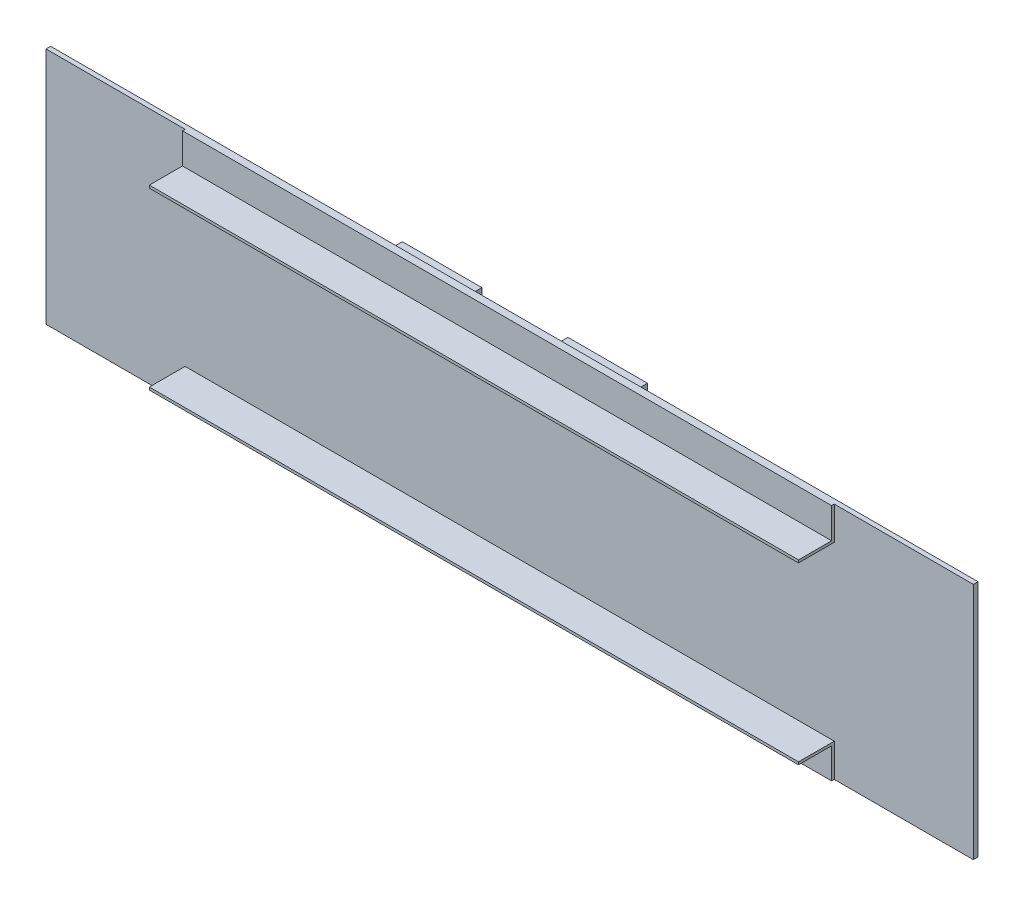
ISO-10303-21;
HEADER;
FILE_DESCRIPTION(('STEP AP214'),'2;1');
FILE_NAME('part.step','',(''),(''),'','','');
FILE_SCHEMA(('AUTOMOTIVE_DESIGN { 1 0 10303 214 1 1 1 1 }'));
ENDSEC;
DATA;
#1=APPLICATION_CONTEXT('core data for automotive mechanical design processes');
#2=APPLICATION_PROTOCOL_DEFINITION('international standard','automotive_design',2000,#1);
#3=PRODUCT_CONTEXT('',#1,'mechanical');
#4=PRODUCT('Part','Part','',(#3));
#5=PRODUCT_RELATED_PRODUCT_CATEGORY('part','',(#4));
#6=PRODUCT_DEFINITION_FORMATION('','',#4);
#7=PRODUCT_DEFINITION_CONTEXT('part definition',#1,'design');
#8=PRODUCT_DEFINITION('design','',#6,#7);
#9=PRODUCT_DEFINITION_SHAPE('','',#8);
#10=(LENGTH_UNIT() NAMED_UNIT(*) SI_UNIT(.MILLI.,.METRE.));
#11=(NAMED_UNIT(*) PLANE_ANGLE_UNIT() SI_UNIT($,.RADIAN.));
#12=(NAMED_UNIT(*) SI_UNIT($,.STERADIAN.) SOLID_ANGLE_UNIT());
#13=UNCERTAINTY_MEASURE_WITH_UNIT(LENGTH_MEASURE(1.E-05),#10,'distance_accuracy_value','');
#14=(GEOMETRIC_REPRESENTATION_CONTEXT(3) GLOBAL_UNCERTAINTY_ASSIGNED_CONTEXT((#13)) GLOBAL_UNIT_ASSIGNED_CONTEXT((#10,
#11,#12)) REPRESENTATION_CONTEXT('',''));
#15=CARTESIAN_POINT('',(0.,0.,0.));
#16=DIRECTION('',(0.,0.,1.));
#17=DIRECTION('',(1.,0.,0.));
#18=AXIS2_PLACEMENT_3D('',#15,#16,#17);
#19=CARTESIAN_POINT('',(1400.,-360.,0.));
#20=DIRECTION('',(0.,0.,1.));
#21=DIRECTION('',(1.,0.,0.));
#22=AXIS2_PLACEMENT_3D('',#19,#20,#21);
#23=PLANE('',#22);
#24=DIRECTION('',(0.,1.,0.));
#25=VECTOR('',#24,1.);
#26=CARTESIAN_POINT('',(-370.000000000001,-360.,0.));
#27=LINE('',#26,#25);
#28=CARTESIAN_POINT('',(-370.000000000001,-348.,0.));
#29=VERTEX_POINT('',#28);
#30=CARTESIAN_POINT('',(-370.000000000001,-268.,0.));
#31=VERTEX_POINT('',#30);
#32=EDGE_CURVE('E338',#29,#31,#27,.T.);
#33=ORIENTED_EDGE('',*,*,#32,.F.);
#34=DIRECTION('',(-1.,0.,0.));
#35=VECTOR('',#34,1.);
#36=CARTESIAN_POINT('',(1400.,-348.,0.));
#37=LINE('',#36,#35);
#38=CARTESIAN_POINT('',(-130.000000000001,-348.,0.));
#39=VERTEX_POINT('',#38);
#40=EDGE_CURVE('E42',#39,#29,#37,.T.);
#41=ORIENTED_EDGE('',*,*,#40,.F.);
#42=DIRECTION('',(0.,-1.,0.));
#43=VECTOR('',#42,1.);
#44=CARTESIAN_POINT('',(-130.000000000001,-360.,0.));
#45=LINE('',#44,#43);
#46=CARTESIAN_POINT('',(-130.000000000001,-268.,0.));
#47=VERTEX_POINT('',#46);
#48=EDGE_CURVE('E327',#47,#39,#45,.T.);
#49=ORIENTED_EDGE('',*,*,#48,.F.);
#50=DIRECTION('',(1.,0.,0.));
#51=VECTOR('',#50,1.);
#52=CARTESIAN_POINT('',(1400.,-268.,0.));
#53=LINE('',#52,#51);
#54=EDGE_CURVE('E11',#31,#47,#53,.T.);
#55=ORIENTED_EDGE('',*,*,#54,.F.);
#56=EDGE_LOOP('',(#33,#41,#49,#55));
#57=FACE_BOUND('',#56,.T.);
#58=DIRECTION('',(-1.,0.,0.));
#59=VECTOR('',#58,1.);
#60=CARTESIAN_POINT('',(1400.,348.,0.));
#61=LINE('',#60,#59);
#62=CARTESIAN_POINT('',(-130.000000000001,348.,0.));
#63=VERTEX_POINT('',#62);
#64=CARTESIAN_POINT('',(-370.000000000001,348.,0.));
#65=VERTEX_POINT('',#64);
#66=EDGE_CURVE('E373',#63,#65,#61,.T.);
#67=ORIENTED_EDGE('',*,*,#66,.T.);
#68=DIRECTION('',(0.,-1.,0.));
#69=VECTOR('',#68,1.);
#70=CARTESIAN_POINT('',(-370.000000000001,-360.,0.));
#71=LINE('',#70,#69);
#72=CARTESIAN_POINT('',(-370.000000000001,268.,0.));
#73=VERTEX_POINT('',#72);
#74=EDGE_CURVE('E367',#65,#73,#71,.T.);
#75=ORIENTED_EDGE('',*,*,#74,.T.);
#76=DIRECTION('',(1.,0.,0.));
#77=VECTOR('',#76,1.);
#78=CARTESIAN_POINT('',(1400.,268.,0.));
#79=LINE('',#78,#77);
#80=CARTESIAN_POINT('',(-130.000000000001,268.,0.));
#81=VERTEX_POINT('',#80);
#82=EDGE_CURVE('E370',#73,#81,#79,.T.);
#83=ORIENTED_EDGE('',*,*,#82,.T.);
#84=DIRECTION('',(0.,1.,0.));
#85=VECTOR('',#84,1.);
#86=CARTESIAN_POINT('',(-130.000000000001,-360.,0.));
#87=LINE('',#86,#85);
#88=EDGE_CURVE('E357',#81,#63,#87,.T.);
#89=ORIENTED_EDGE('',*,*,#88,.T.);
#90=EDGE_LOOP('',(#67,#75,#83,#89));
#91=FACE_BOUND('',#90,.T.);
#92=DIRECTION('',(0.,1.,0.));
#93=VECTOR('',#92,1.);
#94=CARTESIAN_POINT('',(1400.,360.,0.));
#95=LINE('',#94,#93);
#96=CARTESIAN_POINT('',(1400.,-360.,0.));
#97=VERTEX_POINT('',#96);
#98=CARTESIAN_POINT('',(1400.,360.,0.));
#99=VERTEX_POINT('',#98);
#100=EDGE_CURVE('E466',#97,#99,#95,.T.);
#101=ORIENTED_EDGE('',*,*,#100,.F.);
#102=DIRECTION('',(1.,0.,0.));
#103=VECTOR('',#102,1.);
#104=CARTESIAN_POINT('',(-1400.,-360.,0.));
#105=LINE('',#104,#103);
#106=CARTESIAN_POINT('',(-1400.,-360.,0.));
#107=VERTEX_POINT('',#106);
#108=EDGE_CURVE('E473',#107,#97,#105,.T.);
#109=ORIENTED_EDGE('',*,*,#108,.F.);
#110=DIRECTION('',(0.,-1.,0.));
#111=VECTOR('',#110,1.);
#112=CARTESIAN_POINT('',(-1400.,360.,0.));
#113=LINE('',#112,#111);
#114=CARTESIAN_POINT('',(-1400.,360.,0.));
#115=VERTEX_POINT('',#114);
#116=EDGE_CURVE('E471',#115,#107,#113,.T.);
#117=ORIENTED_EDGE('',*,*,#116,.F.);
#118=DIRECTION('',(-1.,0.,0.));
#119=VECTOR('',#118,1.);
#120=CARTESIAN_POINT('',(-1400.,360.,0.));
#121=LINE('',#120,#119);
#122=EDGE_CURVE('E468',#99,#115,#121,.T.);
#123=ORIENTED_EDGE('',*,*,#122,.F.);
#124=EDGE_LOOP('',(#101,#109,#117,#123));
#125=FACE_BOUND('',#124,.T.);
#126=DIRECTION('',(1.,0.,0.));
#127=VECTOR('',#126,1.);
#128=CARTESIAN_POINT('',(1400.,-348.,0.));
#129=LINE('',#128,#127);
#130=CARTESIAN_POINT('',(130.000000000001,-348.,0.));
#131=VERTEX_POINT('',#130);
#132=CARTESIAN_POINT('',(370.000000000001,-348.,0.));
#133=VERTEX_POINT('',#132);
#134=EDGE_CURVE('E311',#131,#133,#129,.T.);
#135=ORIENTED_EDGE('',*,*,#134,.T.);
#136=DIRECTION('',(0.,1.,0.));
#137=VECTOR('',#136,1.);
#138=CARTESIAN_POINT('',(370.000000000001,-360.,0.));
#139=LINE('',#138,#137);
#140=CARTESIAN_POINT('',(370.000000000001,-268.,0.));
#141=VERTEX_POINT('',#140);
#142=EDGE_CURVE('E305',#133,#141,#139,.T.);
#143=ORIENTED_EDGE('',*,*,#142,.T.);
#144=DIRECTION('',(-1.,0.,0.));
#145=VECTOR('',#144,1.);
#146=CARTESIAN_POINT('',(1400.,-268.,0.));
#147=LINE('',#146,#145);
#148=CARTESIAN_POINT('',(130.000000000001,-268.,0.));
#149=VERTEX_POINT('',#148);
#150=EDGE_CURVE('E308',#141,#149,#147,.T.);
#151=ORIENTED_EDGE('',*,*,#150,.T.);
#152=DIRECTION('',(0.,-1.,0.));
#153=VECTOR('',#152,1.);
#154=CARTESIAN_POINT('',(130.000000000001,-360.,0.));
#155=LINE('',#154,#153);
#156=EDGE_CURVE('E295',#149,#131,#155,.T.);
#157=ORIENTED_EDGE('',*,*,#156,.T.);
#158=EDGE_LOOP('',(#135,#143,#151,#157));
#159=FACE_BOUND('',#158,.T.);
#160=DIRECTION('',(0.,-1.,0.));
#161=VECTOR('',#160,1.);
#162=CARTESIAN_POINT('',(370.000000000001,-360.,0.));
#163=LINE('',#162,#161);
#164=CARTESIAN_POINT('',(370.000000000001,348.,0.));
#165=VERTEX_POINT('',#164);
#166=CARTESIAN_POINT('',(370.000000000001,268.,0.));
#167=VERTEX_POINT('',#166);
#168=EDGE_CURVE('E275',#165,#167,#163,.T.);
#169=ORIENTED_EDGE('',*,*,#168,.F.);
#170=DIRECTION('',(1.,0.,0.));
#171=VECTOR('',#170,1.);
#172=CARTESIAN_POINT('',(1400.,348.,0.));
#173=LINE('',#172,#171);
#174=CARTESIAN_POINT('',(130.000000000001,348.,0.));
#175=VERTEX_POINT('',#174);
#176=EDGE_CURVE('E257',#175,#165,#173,.T.);
#177=ORIENTED_EDGE('',*,*,#176,.F.);
#178=DIRECTION('',(0.,1.,0.));
#179=VECTOR('',#178,1.);
#180=CARTESIAN_POINT('',(130.000000000001,-360.,0.));
#181=LINE('',#180,#179);
#182=CARTESIAN_POINT('',(130.000000000001,268.,0.));
#183=VERTEX_POINT('',#182);
#184=EDGE_CURVE('E54',#183,#175,#181,.T.);
#185=ORIENTED_EDGE('',*,*,#184,.F.);
#186=DIRECTION('',(-1.,0.,0.));
#187=VECTOR('',#186,1.);
#188=CARTESIAN_POINT('',(1400.,268.,0.));
#189=LINE('',#188,#187);
#190=EDGE_CURVE('E49',#167,#183,#189,.T.);
#191=ORIENTED_EDGE('',*,*,#190,.F.);
#192=EDGE_LOOP('',(#169,#177,#185,#191));
#193=FACE_BOUND('',#192,.T.);
#194=ADVANCED_FACE('F34',(#57,#91,#125,#159,#193),#23,.F.);
#195=CARTESIAN_POINT('',(-980.000000000001,-260.,22.));
#196=DIRECTION('',(0.,0.,1.));
#197=DIRECTION('',(1.,0.,0.));
#198=AXIS2_PLACEMENT_3D('',#195,#196,#197);
#199=PLANE('',#198);
#200=DIRECTION('',(-1.,0.,0.));
#201=VECTOR('',#200,1.);
#202=CARTESIAN_POINT('',(-980.000000000001,-268.,22.));
#203=LINE('',#202,#201);
#204=CARTESIAN_POINT('',(980.000000000001,-268.,22.));
#205=VERTEX_POINT('',#204);
#206=CARTESIAN_POINT('',(-980.000000000001,-268.,22.));
#207=VERTEX_POINT('',#206);
#208=EDGE_CURVE('E410',#205,#207,#203,.T.);
#209=ORIENTED_EDGE('',*,*,#208,.T.);
#210=DIRECTION('',(0.,1.,0.));
#211=VECTOR('',#210,1.);
#212=CARTESIAN_POINT('',(-980.000000000001,-360.,22.));
#213=LINE('',#212,#211);
#214=CARTESIAN_POINT('',(-980.000000000001,-360.,22.));
#215=VERTEX_POINT('',#214);
#216=EDGE_CURVE('E427',#215,#207,#213,.T.);
#217=ORIENTED_EDGE('',*,*,#216,.F.);
#218=DIRECTION('',(-1.,0.,0.));
#219=VECTOR('',#218,1.);
#220=CARTESIAN_POINT('',(-980.000000000001,-360.,22.));
#221=LINE('',#220,#219);
#222=CARTESIAN_POINT('',(980.000000000001,-360.,22.));
#223=VERTEX_POINT('',#222);
#224=EDGE_CURVE('E510',#223,#215,#221,.T.);
#225=ORIENTED_EDGE('',*,*,#224,.F.);
#226=DIRECTION('',(0.,1.,0.));
#227=VECTOR('',#226,1.);
#228=CARTESIAN_POINT('',(980.000000000001,-360.,22.));
#229=LINE('',#228,#227);
#230=EDGE_CURVE('E400',#223,#205,#229,.T.);
#231=ORIENTED_EDGE('',*,*,#230,.T.);
#232=EDGE_LOOP('',(#209,#217,#225,#231));
#233=FACE_BOUND('',#232,.T.);
#234=ADVANCED_FACE('F508',(#233),#199,.T.);
#235=CARTESIAN_POINT('',(1400.,-360.,14.));
#236=DIRECTION('',(0.,0.,1.));
#237=DIRECTION('',(1.,0.,0.));
#238=AXIS2_PLACEMENT_3D('',#235,#236,#237);
#239=PLANE('',#238);
#240=DIRECTION('',(0.,-1.,0.));
#241=VECTOR('',#240,1.);
#242=CARTESIAN_POINT('',(980.000000000001,360.,14.));
#243=LINE('',#242,#241);
#244=CARTESIAN_POINT('',(980.000000000001,360.,14.));
#245=VERTEX_POINT('',#244);
#246=CARTESIAN_POINT('',(980.000000000001,260.,14.));
#247=VERTEX_POINT('',#246);
#248=EDGE_CURVE('E382',#245,#247,#243,.T.);
#249=ORIENTED_EDGE('',*,*,#248,.T.);
#250=DIRECTION('',(1.,0.,0.));
#251=VECTOR('',#250,1.);
#252=CARTESIAN_POINT('',(-980.000000000001,260.,14.));
#253=LINE('',#252,#251);
#254=CARTESIAN_POINT('',(-980.000000000001,260.,14.));
#255=VERTEX_POINT('',#254);
#256=EDGE_CURVE('E546',#255,#247,#253,.T.);
#257=ORIENTED_EDGE('',*,*,#256,.F.);
#258=DIRECTION('',(0.,-1.,0.));
#259=VECTOR('',#258,1.);
#260=CARTESIAN_POINT('',(-980.000000000001,360.,14.));
#261=LINE('',#260,#259);
#262=CARTESIAN_POINT('',(-980.000000000001,360.,14.));
#263=VERTEX_POINT('',#262);
#264=EDGE_CURVE('E539',#263,#255,#261,.T.);
#265=ORIENTED_EDGE('',*,*,#264,.F.);
#266=DIRECTION('',(-1.,0.,0.));
#267=VECTOR('',#266,1.);
#268=CARTESIAN_POINT('',(-1400.,360.,14.));
#269=LINE('',#268,#267);
#270=CARTESIAN_POINT('',(-1400.,360.,14.));
#271=VERTEX_POINT('',#270);
#272=EDGE_CURVE('E453',#263,#271,#269,.T.);
#273=ORIENTED_EDGE('',*,*,#272,.T.);
#274=DIRECTION('',(0.,-1.,0.));
#275=VECTOR('',#274,1.);
#276=CARTESIAN_POINT('',(-1400.,360.,14.));
#277=LINE('',#276,#275);
#278=CARTESIAN_POINT('',(-1400.,-360.,14.));
#279=VERTEX_POINT('',#278);
#280=EDGE_CURVE('E452',#271,#279,#277,.T.);
#281=ORIENTED_EDGE('',*,*,#280,.T.);
#282=DIRECTION('',(1.,0.,0.));
#283=VECTOR('',#282,1.);
#284=CARTESIAN_POINT('',(-1400.,-360.,14.));
#285=LINE('',#284,#283);
#286=CARTESIAN_POINT('',(-980.000000000001,-360.,14.));
#287=VERTEX_POINT('',#286);
#288=EDGE_CURVE('E463',#279,#287,#285,.T.);
#289=ORIENTED_EDGE('',*,*,#288,.T.);
#290=DIRECTION('',(0.,1.,0.));
#291=VECTOR('',#290,1.);
#292=CARTESIAN_POINT('',(-980.000000000001,-360.,14.));
#293=LINE('',#292,#291);
#294=CARTESIAN_POINT('',(-980.000000000001,-260.,14.));
#295=VERTEX_POINT('',#294);
#296=EDGE_CURVE('E431',#287,#295,#293,.T.);
#297=ORIENTED_EDGE('',*,*,#296,.T.);
#298=DIRECTION('',(1.,0.,0.));
#299=VECTOR('',#298,1.);
#300=CARTESIAN_POINT('',(-980.000000000001,-260.,14.));
#301=LINE('',#300,#299);
#302=CARTESIAN_POINT('',(980.000000000001,-260.,14.));
#303=VERTEX_POINT('',#302);
#304=EDGE_CURVE('E501',#295,#303,#301,.T.);
#305=ORIENTED_EDGE('',*,*,#304,.T.);
#306=DIRECTION('',(0.,1.,0.));
#307=VECTOR('',#306,1.);
#308=CARTESIAN_POINT('',(980.000000000001,-360.,14.));
#309=LINE('',#308,#307);
#310=CARTESIAN_POINT('',(980.000000000001,-360.,14.));
#311=VERTEX_POINT('',#310);
#312=EDGE_CURVE('E399',#311,#303,#309,.T.);
#313=ORIENTED_EDGE('',*,*,#312,.F.);
#314=CARTESIAN_POINT('',(1400.,-360.,14.));
#315=VERTEX_POINT('',#314);
#316=EDGE_CURVE('E462',#311,#315,#285,.T.);
#317=ORIENTED_EDGE('',*,*,#316,.T.);
#318=DIRECTION('',(0.,1.,0.));
#319=VECTOR('',#318,1.);
#320=CARTESIAN_POINT('',(1400.,360.,14.));
#321=LINE('',#320,#319);
#322=CARTESIAN_POINT('',(1400.,360.,14.));
#323=VERTEX_POINT('',#322);
#324=EDGE_CURVE('E458',#315,#323,#321,.T.);
#325=ORIENTED_EDGE('',*,*,#324,.T.);
#326=EDGE_CURVE('E448',#323,#245,#269,.T.);
#327=ORIENTED_EDGE('',*,*,#326,.T.);
#328=EDGE_LOOP('',(#249,#257,#265,#273,#281,#289,#297,#305,#313,#317,#325,#327));
#329=FACE_BOUND('',#328,.T.);
#330=ADVANCED_FACE('F499',(#329),#239,.T.);
#331=CARTESIAN_POINT('',(1400.,360.,14.));
#332=DIRECTION('',(-1.,0.,0.));
#333=DIRECTION('',(0.,0.,1.));
#334=AXIS2_PLACEMENT_3D('',#331,#332,#333);
#335=PLANE('',#334);
#336=ORIENTED_EDGE('',*,*,#100,.T.);
#337=DIRECTION('',(0.,0.,-1.));
#338=VECTOR('',#337,1.);
#339=CARTESIAN_POINT('',(1400.,360.,14.));
#340=LINE('',#339,#338);
#341=EDGE_CURVE('E434',#323,#99,#340,.T.);
#342=ORIENTED_EDGE('',*,*,#341,.F.);
#343=ORIENTED_EDGE('',*,*,#324,.F.);
#344=DIRECTION('',(0.,0.,-1.));
#345=VECTOR('',#344,1.);
#346=CARTESIAN_POINT('',(1400.,-360.,14.));
#347=LINE('',#346,#345);
#348=EDGE_CURVE('E465',#315,#97,#347,.T.);
#349=ORIENTED_EDGE('',*,*,#348,.T.);
#350=EDGE_LOOP('',(#336,#342,#343,#349));
#351=FACE_BOUND('',#350,.T.);
#352=ADVANCED_FACE('F36',(#351),#335,.F.);
#353=CARTESIAN_POINT('',(-1400.,360.,14.));
#354=DIRECTION('',(0.,-1.,0.));
#355=DIRECTION('',(0.,0.,-1.));
#356=AXIS2_PLACEMENT_3D('',#353,#354,#355);
#357=PLANE('',#356);
#358=DIRECTION('',(0.,0.,-1.));
#359=VECTOR('',#358,1.);
#360=CARTESIAN_POINT('',(980.000000000001,360.,22.));
#361=LINE('',#360,#359);
#362=CARTESIAN_POINT('',(980.000000000001,360.,22.));
#363=VERTEX_POINT('',#362);
#364=EDGE_CURVE('E391',#363,#245,#361,.T.);
#365=ORIENTED_EDGE('',*,*,#364,.T.);
#366=ORIENTED_EDGE('',*,*,#326,.F.);
#367=ORIENTED_EDGE('',*,*,#341,.T.);
#368=ORIENTED_EDGE('',*,*,#122,.T.);
#369=DIRECTION('',(0.,0.,-1.));
#370=VECTOR('',#369,1.);
#371=CARTESIAN_POINT('',(-1400.,360.,14.));
#372=LINE('',#371,#370);
#373=EDGE_CURVE('E438',#271,#115,#372,.T.);
#374=ORIENTED_EDGE('',*,*,#373,.F.);
#375=ORIENTED_EDGE('',*,*,#272,.F.);
#376=DIRECTION('',(0.,0.,-1.));
#377=VECTOR('',#376,1.);
#378=CARTESIAN_POINT('',(-980.000000000001,360.,22.));
#379=LINE('',#378,#377);
#380=CARTESIAN_POINT('',(-980.000000000001,360.,22.));
#381=VERTEX_POINT('',#380);
#382=EDGE_CURVE('E552',#381,#263,#379,.T.);
#383=ORIENTED_EDGE('',*,*,#382,.F.);
#384=DIRECTION('',(-1.,0.,0.));
#385=VECTOR('',#384,1.);
#386=CARTESIAN_POINT('',(-980.000000000001,360.,22.));
#387=LINE('',#386,#385);
#388=EDGE_CURVE('E553',#363,#381,#387,.T.);
#389=ORIENTED_EDGE('',*,*,#388,.F.);
#390=EDGE_LOOP('',(#365,#366,#367,#368,#374,#375,#383,#389));
#391=FACE_BOUND('',#390,.T.);
#392=ADVANCED_FACE('F584',(#391),#357,.F.);
#393=CARTESIAN_POINT('',(-1400.,360.,14.));
#394=DIRECTION('',(1.,0.,0.));
#395=DIRECTION('',(0.,0.,-1.));
#396=AXIS2_PLACEMENT_3D('',#393,#394,#395);
#397=PLANE('',#396);
#398=ORIENTED_EDGE('',*,*,#116,.T.);
#399=DIRECTION('',(0.,0.,-1.));
#400=VECTOR('',#399,1.);
#401=CARTESIAN_POINT('',(-1400.,-360.,14.));
#402=LINE('',#401,#400);
#403=EDGE_CURVE('E444',#279,#107,#402,.T.);
#404=ORIENTED_EDGE('',*,*,#403,.F.);
#405=ORIENTED_EDGE('',*,*,#280,.F.);
#406=ORIENTED_EDGE('',*,*,#373,.T.);
#407=EDGE_LOOP('',(#398,#404,#405,#406));
#408=FACE_BOUND('',#407,.T.);
#409=ADVANCED_FACE('F571',(#408),#397,.F.);
#410=CARTESIAN_POINT('',(-1400.,-360.,14.));
#411=DIRECTION('',(0.,1.,0.));
#412=DIRECTION('',(0.,0.,1.));
#413=AXIS2_PLACEMENT_3D('',#410,#411,#412);
#414=PLANE('',#413);
#415=ORIENTED_EDGE('',*,*,#316,.F.);
#416=DIRECTION('',(0.,0.,-1.));
#417=VECTOR('',#416,1.);
#418=CARTESIAN_POINT('',(980.000000000001,-360.,22.));
#419=LINE('',#418,#417);
#420=EDGE_CURVE('E403',#223,#311,#419,.T.);
#421=ORIENTED_EDGE('',*,*,#420,.F.);
#422=ORIENTED_EDGE('',*,*,#224,.T.);
#423=DIRECTION('',(0.,0.,-1.));
#424=VECTOR('',#423,1.);
#425=CARTESIAN_POINT('',(-980.000000000001,-360.,22.));
#426=LINE('',#425,#424);
#427=EDGE_CURVE('E514',#215,#287,#426,.T.);
#428=ORIENTED_EDGE('',*,*,#427,.T.);
#429=ORIENTED_EDGE('',*,*,#288,.F.);
#430=ORIENTED_EDGE('',*,*,#403,.T.);
#431=ORIENTED_EDGE('',*,*,#108,.T.);
#432=ORIENTED_EDGE('',*,*,#348,.F.);
#433=EDGE_LOOP('',(#415,#421,#422,#428,#429,#430,#431,#432));
#434=FACE_BOUND('',#433,.T.);
#435=ADVANCED_FACE('F482',(#434),#414,.F.);
#436=CARTESIAN_POINT('',(-980.000000000001,360.,22.));
#437=DIRECTION('',(1.,0.,0.));
#438=DIRECTION('',(0.,0.,-1.));
#439=AXIS2_PLACEMENT_3D('',#436,#437,#438);
#440=PLANE('',#439);
#441=ORIENTED_EDGE('',*,*,#264,.T.);
#442=DIRECTION('',(0.,0.,-1.));
#443=VECTOR('',#442,1.);
#444=CARTESIAN_POINT('',(-980.000000000001,260.,22.));
#445=LINE('',#444,#443);
#446=CARTESIAN_POINT('',(-980.000000000001,260.,122.));
#447=VERTEX_POINT('',#446);
#448=EDGE_CURVE('E469',#447,#255,#445,.T.);
#449=ORIENTED_EDGE('',*,*,#448,.F.);
#450=DIRECTION('',(0.,-1.,0.));
#451=VECTOR('',#450,1.);
#452=CARTESIAN_POINT('',(-980.000000000001,260.,122.));
#453=LINE('',#452,#451);
#454=CARTESIAN_POINT('',(-980.000000000001,268.,122.));
#455=VERTEX_POINT('',#454);
#456=EDGE_CURVE('E521',#455,#447,#453,.T.);
#457=ORIENTED_EDGE('',*,*,#456,.F.);
#458=DIRECTION('',(0.,0.,-1.));
#459=VECTOR('',#458,1.);
#460=CARTESIAN_POINT('',(-980.000000000001,268.,122.));
#461=LINE('',#460,#459);
#462=CARTESIAN_POINT('',(-980.000000000001,268.,22.));
#463=VERTEX_POINT('',#462);
#464=EDGE_CURVE('E528',#455,#463,#461,.T.);
#465=ORIENTED_EDGE('',*,*,#464,.T.);
#466=DIRECTION('',(0.,-1.,0.));
#467=VECTOR('',#466,1.);
#468=CARTESIAN_POINT('',(-980.000000000001,360.,22.));
#469=LINE('',#468,#467);
#470=EDGE_CURVE('E536',#381,#463,#469,.T.);
#471=ORIENTED_EDGE('',*,*,#470,.F.);
#472=ORIENTED_EDGE('',*,*,#382,.T.);
#473=EDGE_LOOP('',(#441,#449,#457,#465,#471,#472));
#474=FACE_BOUND('',#473,.T.);
#475=ADVANCED_FACE('F561',(#474),#440,.F.);
#476=CARTESIAN_POINT('',(-980.000000000001,260.,22.));
#477=DIRECTION('',(0.,1.,0.));
#478=DIRECTION('',(0.,0.,1.));
#479=AXIS2_PLACEMENT_3D('',#476,#477,#478);
#480=PLANE('',#479);
#481=ORIENTED_EDGE('',*,*,#256,.T.);
#482=DIRECTION('',(0.,0.,-1.));
#483=VECTOR('',#482,1.);
#484=CARTESIAN_POINT('',(980.000000000001,260.,22.));
#485=LINE('',#484,#483);
#486=CARTESIAN_POINT('',(980.000000000001,260.,122.));
#487=VERTEX_POINT('',#486);
#488=EDGE_CURVE('E386',#487,#247,#485,.T.);
#489=ORIENTED_EDGE('',*,*,#488,.F.);
#490=DIRECTION('',(1.,0.,0.));
#491=VECTOR('',#490,1.);
#492=CARTESIAN_POINT('',(-980.000000000001,260.,122.));
#493=LINE('',#492,#491);
#494=EDGE_CURVE('E524',#447,#487,#493,.T.);
#495=ORIENTED_EDGE('',*,*,#494,.F.);
#496=ORIENTED_EDGE('',*,*,#448,.T.);
#497=EDGE_LOOP('',(#481,#489,#495,#496));
#498=FACE_BOUND('',#497,.T.);
#499=ADVANCED_FACE('F563',(#498),#480,.F.);
#500=CARTESIAN_POINT('',(-980.000000000001,260.,22.));
#501=DIRECTION('',(0.,0.,1.));
#502=DIRECTION('',(1.,0.,0.));
#503=AXIS2_PLACEMENT_3D('',#500,#501,#502);
#504=PLANE('',#503);
#505=ORIENTED_EDGE('',*,*,#470,.T.);
#506=DIRECTION('',(-1.,0.,0.));
#507=VECTOR('',#506,1.);
#508=CARTESIAN_POINT('',(-980.000000000001,268.,22.));
#509=LINE('',#508,#507);
#510=CARTESIAN_POINT('',(980.000000000001,268.,22.));
#511=VERTEX_POINT('',#510);
#512=EDGE_CURVE('E520',#511,#463,#509,.T.);
#513=ORIENTED_EDGE('',*,*,#512,.F.);
#514=DIRECTION('',(0.,-1.,0.));
#515=VECTOR('',#514,1.);
#516=CARTESIAN_POINT('',(980.000000000001,360.,22.));
#517=LINE('',#516,#515);
#518=EDGE_CURVE('E383',#363,#511,#517,.T.);
#519=ORIENTED_EDGE('',*,*,#518,.F.);
#520=ORIENTED_EDGE('',*,*,#388,.T.);
#521=EDGE_LOOP('',(#505,#513,#519,#520));
#522=FACE_BOUND('',#521,.T.);
#523=ADVANCED_FACE('F560',(#522),#504,.T.);
#524=CARTESIAN_POINT('',(-980.000000000001,268.,122.));
#525=DIRECTION('',(0.,-1.,0.));
#526=DIRECTION('',(0.,0.,-1.));
#527=AXIS2_PLACEMENT_3D('',#524,#525,#526);
#528=PLANE('',#527);
#529=ORIENTED_EDGE('',*,*,#512,.T.);
#530=ORIENTED_EDGE('',*,*,#464,.F.);
#531=DIRECTION('',(-1.,0.,0.));
#532=VECTOR('',#531,1.);
#533=CARTESIAN_POINT('',(-980.000000000001,268.,122.));
#534=LINE('',#533,#532);
#535=CARTESIAN_POINT('',(980.000000000001,268.,122.));
#536=VERTEX_POINT('',#535);
#537=EDGE_CURVE('E526',#536,#455,#534,.T.);
#538=ORIENTED_EDGE('',*,*,#537,.F.);
#539=DIRECTION('',(0.,0.,-1.));
#540=VECTOR('',#539,1.);
#541=CARTESIAN_POINT('',(980.000000000001,268.,122.));
#542=LINE('',#541,#540);
#543=EDGE_CURVE('E379',#536,#511,#542,.T.);
#544=ORIENTED_EDGE('',*,*,#543,.T.);
#545=EDGE_LOOP('',(#529,#530,#538,#544));
#546=FACE_BOUND('',#545,.T.);
#547=ADVANCED_FACE('F601',(#546),#528,.F.);
#548=CARTESIAN_POINT('',(-980.000000000001,268.,122.));
#549=DIRECTION('',(0.,0.,-1.));
#550=DIRECTION('',(-1.,0.,0.));
#551=AXIS2_PLACEMENT_3D('',#548,#549,#550);
#552=PLANE('',#551);
#553=ORIENTED_EDGE('',*,*,#456,.T.);
#554=ORIENTED_EDGE('',*,*,#494,.T.);
#555=DIRECTION('',(0.,-1.,0.));
#556=VECTOR('',#555,1.);
#557=CARTESIAN_POINT('',(980.000000000001,260.,122.));
#558=LINE('',#557,#556);
#559=EDGE_CURVE('E376',#536,#487,#558,.T.);
#560=ORIENTED_EDGE('',*,*,#559,.F.);
#561=ORIENTED_EDGE('',*,*,#537,.T.);
#562=EDGE_LOOP('',(#553,#554,#560,#561));
#563=FACE_BOUND('',#562,.T.);
#564=ADVANCED_FACE('F597',(#563),#552,.F.);
#565=CARTESIAN_POINT('',(-980.000000000001,-360.,22.));
#566=DIRECTION('',(-1.,0.,0.));
#567=DIRECTION('',(0.,0.,1.));
#568=AXIS2_PLACEMENT_3D('',#565,#566,#567);
#569=PLANE('',#568);
#570=ORIENTED_EDGE('',*,*,#296,.F.);
#571=ORIENTED_EDGE('',*,*,#427,.F.);
#572=ORIENTED_EDGE('',*,*,#216,.T.);
#573=DIRECTION('',(0.,0.,-1.));
#574=VECTOR('',#573,1.);
#575=CARTESIAN_POINT('',(-980.000000000001,-268.,122.));
#576=LINE('',#575,#574);
#577=CARTESIAN_POINT('',(-980.000000000001,-268.,122.));
#578=VERTEX_POINT('',#577);
#579=EDGE_CURVE('E419',#578,#207,#576,.T.);
#580=ORIENTED_EDGE('',*,*,#579,.F.);
#581=DIRECTION('',(0.,1.,0.));
#582=VECTOR('',#581,1.);
#583=CARTESIAN_POINT('',(-980.000000000001,-260.,122.));
#584=LINE('',#583,#582);
#585=CARTESIAN_POINT('',(-980.000000000001,-260.,122.));
#586=VERTEX_POINT('',#585);
#587=EDGE_CURVE('E411',#578,#586,#584,.T.);
#588=ORIENTED_EDGE('',*,*,#587,.T.);
#589=DIRECTION('',(0.,0.,-1.));
#590=VECTOR('',#589,1.);
#591=CARTESIAN_POINT('',(-980.000000000001,-260.,22.));
#592=LINE('',#591,#590);
#593=EDGE_CURVE('E512',#586,#295,#592,.T.);
#594=ORIENTED_EDGE('',*,*,#593,.T.);
#595=EDGE_LOOP('',(#570,#571,#572,#580,#588,#594));
#596=FACE_BOUND('',#595,.T.);
#597=ADVANCED_FACE('F608',(#596),#569,.T.);
#598=CARTESIAN_POINT('',(-980.000000000001,-260.,22.));
#599=DIRECTION('',(0.,1.,0.));
#600=DIRECTION('',(0.,0.,1.));
#601=AXIS2_PLACEMENT_3D('',#598,#599,#600);
#602=PLANE('',#601);
#603=ORIENTED_EDGE('',*,*,#304,.F.);
#604=ORIENTED_EDGE('',*,*,#593,.F.);
#605=DIRECTION('',(1.,0.,0.));
#606=VECTOR('',#605,1.);
#607=CARTESIAN_POINT('',(-980.000000000001,-260.,122.));
#608=LINE('',#607,#606);
#609=CARTESIAN_POINT('',(980.000000000001,-260.,122.));
#610=VERTEX_POINT('',#609);
#611=EDGE_CURVE('E417',#586,#610,#608,.T.);
#612=ORIENTED_EDGE('',*,*,#611,.T.);
#613=DIRECTION('',(0.,0.,-1.));
#614=VECTOR('',#613,1.);
#615=CARTESIAN_POINT('',(980.000000000001,-260.,22.));
#616=LINE('',#615,#614);
#617=EDGE_CURVE('E407',#610,#303,#616,.T.);
#618=ORIENTED_EDGE('',*,*,#617,.T.);
#619=EDGE_LOOP('',(#603,#604,#612,#618));
#620=FACE_BOUND('',#619,.T.);
#621=ADVANCED_FACE('F614',(#620),#602,.T.);
#622=CARTESIAN_POINT('',(-980.000000000001,-268.,122.));
#623=DIRECTION('',(0.,-1.,0.));
#624=DIRECTION('',(0.,0.,-1.));
#625=AXIS2_PLACEMENT_3D('',#622,#623,#624);
#626=PLANE('',#625);
#627=ORIENTED_EDGE('',*,*,#208,.F.);
#628=DIRECTION('',(0.,0.,-1.));
#629=VECTOR('',#628,1.);
#630=CARTESIAN_POINT('',(980.000000000001,-268.,122.));
#631=LINE('',#630,#629);
#632=CARTESIAN_POINT('',(980.000000000001,-268.,122.));
#633=VERTEX_POINT('',#632);
#634=EDGE_CURVE('E396',#633,#205,#631,.T.);
#635=ORIENTED_EDGE('',*,*,#634,.F.);
#636=DIRECTION('',(-1.,0.,0.));
#637=VECTOR('',#636,1.);
#638=CARTESIAN_POINT('',(-980.000000000001,-268.,122.));
#639=LINE('',#638,#637);
#640=EDGE_CURVE('E414',#633,#578,#639,.T.);
#641=ORIENTED_EDGE('',*,*,#640,.T.);
#642=ORIENTED_EDGE('',*,*,#579,.T.);
#643=EDGE_LOOP('',(#627,#635,#641,#642));
#644=FACE_BOUND('',#643,.T.);
#645=ADVANCED_FACE('F617',(#644),#626,.T.);
#646=CARTESIAN_POINT('',(-980.000000000001,-268.,122.));
#647=DIRECTION('',(0.,0.,-1.));
#648=DIRECTION('',(-1.,0.,0.));
#649=AXIS2_PLACEMENT_3D('',#646,#647,#648);
#650=PLANE('',#649);
#651=ORIENTED_EDGE('',*,*,#587,.F.);
#652=ORIENTED_EDGE('',*,*,#640,.F.);
#653=DIRECTION('',(0.,1.,0.));
#654=VECTOR('',#653,1.);
#655=CARTESIAN_POINT('',(980.000000000001,-260.,122.));
#656=LINE('',#655,#654);
#657=EDGE_CURVE('E393',#633,#610,#656,.T.);
#658=ORIENTED_EDGE('',*,*,#657,.T.);
#659=ORIENTED_EDGE('',*,*,#611,.F.);
#660=EDGE_LOOP('',(#651,#652,#658,#659));
#661=FACE_BOUND('',#660,.T.);
#662=ADVANCED_FACE('F622',(#661),#650,.F.);
#663=CARTESIAN_POINT('',(980.000000000001,-360.,22.));
#664=DIRECTION('',(-1.,0.,0.));
#665=DIRECTION('',(0.,0.,1.));
#666=AXIS2_PLACEMENT_3D('',#663,#664,#665);
#667=PLANE('',#666);
#668=ORIENTED_EDGE('',*,*,#312,.T.);
#669=ORIENTED_EDGE('',*,*,#617,.F.);
#670=ORIENTED_EDGE('',*,*,#657,.F.);
#671=ORIENTED_EDGE('',*,*,#634,.T.);
#672=ORIENTED_EDGE('',*,*,#230,.F.);
#673=ORIENTED_EDGE('',*,*,#420,.T.);
#674=EDGE_LOOP('',(#668,#669,#670,#671,#672,#673));
#675=FACE_BOUND('',#674,.T.);
#676=ADVANCED_FACE('F504',(#675),#667,.F.);
#677=CARTESIAN_POINT('',(980.000000000001,360.,22.));
#678=DIRECTION('',(1.,0.,0.));
#679=DIRECTION('',(0.,0.,-1.));
#680=AXIS2_PLACEMENT_3D('',#677,#678,#679);
#681=PLANE('',#680);
#682=ORIENTED_EDGE('',*,*,#248,.F.);
#683=ORIENTED_EDGE('',*,*,#364,.F.);
#684=ORIENTED_EDGE('',*,*,#518,.T.);
#685=ORIENTED_EDGE('',*,*,#543,.F.);
#686=ORIENTED_EDGE('',*,*,#559,.T.);
#687=ORIENTED_EDGE('',*,*,#488,.T.);
#688=EDGE_LOOP('',(#682,#683,#684,#685,#686,#687));
#689=FACE_BOUND('',#688,.T.);
#690=ADVANCED_FACE('F592',(#689),#681,.T.);
#691=CARTESIAN_POINT('',(-370.000000000001,348.,-10.));
#692=DIRECTION('',(0.,1.,0.));
#693=DIRECTION('',(0.,0.,1.));
#694=AXIS2_PLACEMENT_3D('',#691,#692,#693);
#695=PLANE('',#694);
#696=ORIENTED_EDGE('',*,*,#66,.F.);
#697=DIRECTION('',(0.,0.,1.));
#698=VECTOR('',#697,1.);
#699=CARTESIAN_POINT('',(-130.000000000001,348.,-10.));
#700=LINE('',#699,#698);
#701=CARTESIAN_POINT('',(-130.000000000001,348.,-32.));
#702=VERTEX_POINT('',#701);
#703=EDGE_CURVE('E358',#702,#63,#700,.T.);
#704=ORIENTED_EDGE('',*,*,#703,.F.);
#705=DIRECTION('',(-1.,0.,0.));
#706=VECTOR('',#705,1.);
#707=CARTESIAN_POINT('',(-370.000000000001,348.,-32.));
#708=LINE('',#707,#706);
#709=CARTESIAN_POINT('',(-370.000000000001,348.,-32.));
#710=VERTEX_POINT('',#709);
#711=EDGE_CURVE('E350',#702,#710,#708,.T.);
#712=ORIENTED_EDGE('',*,*,#711,.T.);
#713=DIRECTION('',(0.,0.,1.));
#714=VECTOR('',#713,1.);
#715=CARTESIAN_POINT('',(-370.000000000001,348.,-10.));
#716=LINE('',#715,#714);
#717=EDGE_CURVE('E354',#710,#65,#716,.T.);
#718=ORIENTED_EDGE('',*,*,#717,.T.);
#719=EDGE_LOOP('',(#696,#704,#712,#718));
#720=FACE_BOUND('',#719,.T.);
#721=ADVANCED_FACE('F631',(#720),#695,.T.);
#722=CARTESIAN_POINT('',(-370.000000000001,268.,-10.));
#723=DIRECTION('',(0.,-1.,0.));
#724=DIRECTION('',(1.,0.,0.));
#725=AXIS2_PLACEMENT_3D('',#722,#723,#724);
#726=PLANE('',#725);
#727=ORIENTED_EDGE('',*,*,#82,.F.);
#728=DIRECTION('',(0.,0.,1.));
#729=VECTOR('',#728,1.);
#730=CARTESIAN_POINT('',(-370.000000000001,268.,-10.));
#731=LINE('',#730,#729);
#732=CARTESIAN_POINT('',(-370.000000000001,268.,-32.));
#733=VERTEX_POINT('',#732);
#734=EDGE_CURVE('E353',#733,#73,#731,.T.);
#735=ORIENTED_EDGE('',*,*,#734,.F.);
#736=DIRECTION('',(1.,0.,0.));
#737=VECTOR('',#736,1.);
#738=CARTESIAN_POINT('',(-370.000000000001,268.,-32.));
#739=LINE('',#738,#737);
#740=CARTESIAN_POINT('',(-130.000000000001,268.,-32.));
#741=VERTEX_POINT('',#740);
#742=EDGE_CURVE('E344',#733,#741,#739,.T.);
#743=ORIENTED_EDGE('',*,*,#742,.T.);
#744=DIRECTION('',(0.,0.,1.));
#745=VECTOR('',#744,1.);
#746=CARTESIAN_POINT('',(-130.000000000001,268.,-10.));
#747=LINE('',#746,#745);
#748=EDGE_CURVE('E361',#741,#81,#747,.T.);
#749=ORIENTED_EDGE('',*,*,#748,.T.);
#750=EDGE_LOOP('',(#727,#735,#743,#749));
#751=FACE_BOUND('',#750,.T.);
#752=ADVANCED_FACE('F636',(#751),#726,.T.);
#753=CARTESIAN_POINT('',(-370.000000000001,268.,-10.));
#754=DIRECTION('',(-1.,0.,0.));
#755=DIRECTION('',(0.,0.,1.));
#756=AXIS2_PLACEMENT_3D('',#753,#754,#755);
#757=PLANE('',#756);
#758=ORIENTED_EDGE('',*,*,#74,.F.);
#759=ORIENTED_EDGE('',*,*,#717,.F.);
#760=DIRECTION('',(0.,-1.,0.));
#761=VECTOR('',#760,1.);
#762=CARTESIAN_POINT('',(-370.000000000001,268.,-32.));
#763=LINE('',#762,#761);
#764=EDGE_CURVE('E341',#710,#733,#763,.T.);
#765=ORIENTED_EDGE('',*,*,#764,.T.);
#766=ORIENTED_EDGE('',*,*,#734,.T.);
#767=EDGE_LOOP('',(#758,#759,#765,#766));
#768=FACE_BOUND('',#767,.T.);
#769=ADVANCED_FACE('F632',(#768),#757,.T.);
#770=CARTESIAN_POINT('',(-130.000000000001,268.,-10.));
#771=DIRECTION('',(1.,0.,0.));
#772=DIRECTION('',(0.,0.,-1.));
#773=AXIS2_PLACEMENT_3D('',#770,#771,#772);
#774=PLANE('',#773);
#775=ORIENTED_EDGE('',*,*,#88,.F.);
#776=ORIENTED_EDGE('',*,*,#748,.F.);
#777=DIRECTION('',(0.,1.,0.));
#778=VECTOR('',#777,1.);
#779=CARTESIAN_POINT('',(-130.000000000001,268.,-32.));
#780=LINE('',#779,#778);
#781=EDGE_CURVE('E347',#741,#702,#780,.T.);
#782=ORIENTED_EDGE('',*,*,#781,.T.);
#783=ORIENTED_EDGE('',*,*,#703,.T.);
#784=EDGE_LOOP('',(#775,#776,#782,#783));
#785=FACE_BOUND('',#784,.T.);
#786=ADVANCED_FACE('F635',(#785),#774,.T.);
#787=CARTESIAN_POINT('',(-370.000000000001,348.,-32.));
#788=DIRECTION('',(0.,0.,-1.));
#789=DIRECTION('',(-1.,0.,0.));
#790=AXIS2_PLACEMENT_3D('',#787,#788,#789);
#791=PLANE('',#790);
#792=ORIENTED_EDGE('',*,*,#764,.F.);
#793=ORIENTED_EDGE('',*,*,#711,.F.);
#794=ORIENTED_EDGE('',*,*,#781,.F.);
#795=ORIENTED_EDGE('',*,*,#742,.F.);
#796=EDGE_LOOP('',(#792,#793,#794,#795));
#797=FACE_BOUND('',#796,.T.);
#798=ADVANCED_FACE('F643',(#797),#791,.T.);
#799=CARTESIAN_POINT('',(-370.000000000001,-268.,-32.));
#800=DIRECTION('',(0.,-1.,0.));
#801=DIRECTION('',(1.,0.,0.));
#802=AXIS2_PLACEMENT_3D('',#799,#800,#801);
#803=PLANE('',#802);
#804=DIRECTION('',(0.,0.,1.));
#805=VECTOR('',#804,1.);
#806=CARTESIAN_POINT('',(-370.000000000001,-268.,-32.));
#807=LINE('',#806,#805);
#808=CARTESIAN_POINT('',(-370.000000000001,-268.,-32.));
#809=VERTEX_POINT('',#808);
#810=EDGE_CURVE('E324',#809,#31,#807,.T.);
#811=ORIENTED_EDGE('',*,*,#810,.T.);
#812=ORIENTED_EDGE('',*,*,#54,.T.);
#813=DIRECTION('',(0.,0.,1.));
#814=VECTOR('',#813,1.);
#815=CARTESIAN_POINT('',(-130.000000000001,-268.,-32.));
#816=LINE('',#815,#814);
#817=CARTESIAN_POINT('',(-130.000000000001,-268.,-32.));
#818=VERTEX_POINT('',#817);
#819=EDGE_CURVE('E328',#818,#47,#816,.T.);
#820=ORIENTED_EDGE('',*,*,#819,.F.);
#821=DIRECTION('',(1.,0.,0.));
#822=VECTOR('',#821,1.);
#823=CARTESIAN_POINT('',(-370.000000000001,-268.,-32.));
#824=LINE('',#823,#822);
#825=EDGE_CURVE('E321',#809,#818,#824,.T.);
#826=ORIENTED_EDGE('',*,*,#825,.F.);
#827=EDGE_LOOP('',(#811,#812,#820,#826));
#828=FACE_BOUND('',#827,.T.);
#829=ADVANCED_FACE('F650',(#828),#803,.F.);
#830=CARTESIAN_POINT('',(-370.000000000001,-348.,-32.));
#831=DIRECTION('',(0.,1.,0.));
#832=DIRECTION('',(0.,0.,1.));
#833=AXIS2_PLACEMENT_3D('',#830,#831,#832);
#834=PLANE('',#833);
#835=DIRECTION('',(0.,0.,1.));
#836=VECTOR('',#835,1.);
#837=CARTESIAN_POINT('',(-130.000000000001,-348.,-32.));
#838=LINE('',#837,#836);
#839=CARTESIAN_POINT('',(-130.000000000001,-348.,-32.));
#840=VERTEX_POINT('',#839);
#841=EDGE_CURVE('E331',#840,#39,#838,.T.);
#842=ORIENTED_EDGE('',*,*,#841,.T.);
#843=ORIENTED_EDGE('',*,*,#40,.T.);
#844=DIRECTION('',(0.,0.,1.));
#845=VECTOR('',#844,1.);
#846=CARTESIAN_POINT('',(-370.000000000001,-348.,-32.));
#847=LINE('',#846,#845);
#848=CARTESIAN_POINT('',(-370.000000000001,-348.,-32.));
#849=VERTEX_POINT('',#848);
#850=EDGE_CURVE('E323',#849,#29,#847,.T.);
#851=ORIENTED_EDGE('',*,*,#850,.F.);
#852=DIRECTION('',(-1.,0.,0.));
#853=VECTOR('',#852,1.);
#854=CARTESIAN_POINT('',(-370.000000000001,-348.,-32.));
#855=LINE('',#854,#853);
#856=EDGE_CURVE('E317',#840,#849,#855,.T.);
#857=ORIENTED_EDGE('',*,*,#856,.F.);
#858=EDGE_LOOP('',(#842,#843,#851,#857));
#859=FACE_BOUND('',#858,.T.);
#860=ADVANCED_FACE('F656',(#859),#834,.F.);
#861=CARTESIAN_POINT('',(-370.000000000001,-268.,-32.));
#862=DIRECTION('',(1.,0.,0.));
#863=DIRECTION('',(0.,0.,-1.));
#864=AXIS2_PLACEMENT_3D('',#861,#862,#863);
#865=PLANE('',#864);
#866=ORIENTED_EDGE('',*,*,#850,.T.);
#867=ORIENTED_EDGE('',*,*,#32,.T.);
#868=ORIENTED_EDGE('',*,*,#810,.F.);
#869=DIRECTION('',(0.,1.,0.));
#870=VECTOR('',#869,1.);
#871=CARTESIAN_POINT('',(-370.000000000001,-268.,-32.));
#872=LINE('',#871,#870);
#873=EDGE_CURVE('E314',#849,#809,#872,.T.);
#874=ORIENTED_EDGE('',*,*,#873,.F.);
#875=EDGE_LOOP('',(#866,#867,#868,#874));
#876=FACE_BOUND('',#875,.T.);
#877=ADVANCED_FACE('F652',(#876),#865,.F.);
#878=CARTESIAN_POINT('',(-130.000000000001,-268.,-32.));
#879=DIRECTION('',(-1.,0.,0.));
#880=DIRECTION('',(0.,0.,1.));
#881=AXIS2_PLACEMENT_3D('',#878,#879,#880);
#882=PLANE('',#881);
#883=ORIENTED_EDGE('',*,*,#819,.T.);
#884=ORIENTED_EDGE('',*,*,#48,.T.);
#885=ORIENTED_EDGE('',*,*,#841,.F.);
#886=DIRECTION('',(0.,-1.,0.));
#887=VECTOR('',#886,1.);
#888=CARTESIAN_POINT('',(-130.000000000001,-268.,-32.));
#889=LINE('',#888,#887);
#890=EDGE_CURVE('E319',#818,#840,#889,.T.);
#891=ORIENTED_EDGE('',*,*,#890,.F.);
#892=EDGE_LOOP('',(#883,#884,#885,#891));
#893=FACE_BOUND('',#892,.T.);
#894=ADVANCED_FACE('F655',(#893),#882,.F.);
#895=CARTESIAN_POINT('',(-370.000000000001,-348.,-32.));
#896=DIRECTION('',(0.,0.,-1.));
#897=DIRECTION('',(-1.,0.,0.));
#898=AXIS2_PLACEMENT_3D('',#895,#896,#897);
#899=PLANE('',#898);
#900=ORIENTED_EDGE('',*,*,#873,.T.);
#901=ORIENTED_EDGE('',*,*,#825,.T.);
#902=ORIENTED_EDGE('',*,*,#890,.T.);
#903=ORIENTED_EDGE('',*,*,#856,.T.);
#904=EDGE_LOOP('',(#900,#901,#902,#903));
#905=FACE_BOUND('',#904,.T.);
#906=ADVANCED_FACE('F662',(#905),#899,.T.);
#907=CARTESIAN_POINT('',(370.000000000001,-348.,-32.));
#908=DIRECTION('',(0.,-1.,0.));
#909=DIRECTION('',(0.,0.,-1.));
#910=AXIS2_PLACEMENT_3D('',#907,#908,#909);
#911=PLANE('',#910);
#912=ORIENTED_EDGE('',*,*,#134,.F.);
#913=DIRECTION('',(0.,0.,1.));
#914=VECTOR('',#913,1.);
#915=CARTESIAN_POINT('',(130.000000000001,-348.,-32.));
#916=LINE('',#915,#914);
#917=CARTESIAN_POINT('',(130.000000000001,-348.,-32.));
#918=VERTEX_POINT('',#917);
#919=EDGE_CURVE('E296',#918,#131,#916,.T.);
#920=ORIENTED_EDGE('',*,*,#919,.F.);
#921=DIRECTION('',(1.,0.,0.));
#922=VECTOR('',#921,1.);
#923=CARTESIAN_POINT('',(370.000000000001,-348.,-32.));
#924=LINE('',#923,#922);
#925=CARTESIAN_POINT('',(370.000000000001,-348.,-32.));
#926=VERTEX_POINT('',#925);
#927=EDGE_CURVE('E288',#918,#926,#924,.T.);
#928=ORIENTED_EDGE('',*,*,#927,.T.);
#929=DIRECTION('',(0.,0.,1.));
#930=VECTOR('',#929,1.);
#931=CARTESIAN_POINT('',(370.000000000001,-348.,-32.));
#932=LINE('',#931,#930);
#933=EDGE_CURVE('E292',#926,#133,#932,.T.);
#934=ORIENTED_EDGE('',*,*,#933,.T.);
#935=EDGE_LOOP('',(#912,#920,#928,#934));
#936=FACE_BOUND('',#935,.T.);
#937=ADVANCED_FACE('F669',(#936),#911,.T.);
#938=CARTESIAN_POINT('',(370.000000000001,-268.,-32.));
#939=DIRECTION('',(0.,1.,0.));
#940=DIRECTION('',(-1.,0.,0.));
#941=AXIS2_PLACEMENT_3D('',#938,#939,#940);
#942=PLANE('',#941);
#943=ORIENTED_EDGE('',*,*,#150,.F.);
#944=DIRECTION('',(0.,0.,1.));
#945=VECTOR('',#944,1.);
#946=CARTESIAN_POINT('',(370.000000000001,-268.,-32.));
#947=LINE('',#946,#945);
#948=CARTESIAN_POINT('',(370.000000000001,-268.,-32.));
#949=VERTEX_POINT('',#948);
#950=EDGE_CURVE('E291',#949,#141,#947,.T.);
#951=ORIENTED_EDGE('',*,*,#950,.F.);
#952=DIRECTION('',(-1.,0.,0.));
#953=VECTOR('',#952,1.);
#954=CARTESIAN_POINT('',(370.000000000001,-268.,-32.));
#955=LINE('',#954,#953);
#956=CARTESIAN_POINT('',(130.000000000001,-268.,-32.));
#957=VERTEX_POINT('',#956);
#958=EDGE_CURVE('E282',#949,#957,#955,.T.);
#959=ORIENTED_EDGE('',*,*,#958,.T.);
#960=DIRECTION('',(0.,0.,1.));
#961=VECTOR('',#960,1.);
#962=CARTESIAN_POINT('',(130.000000000001,-268.,-32.));
#963=LINE('',#962,#961);
#964=EDGE_CURVE('E299',#957,#149,#963,.T.);
#965=ORIENTED_EDGE('',*,*,#964,.T.);
#966=EDGE_LOOP('',(#943,#951,#959,#965));
#967=FACE_BOUND('',#966,.T.);
#968=ADVANCED_FACE('F675',(#967),#942,.T.);
#969=CARTESIAN_POINT('',(370.000000000001,-268.,-32.));
#970=DIRECTION('',(1.,0.,0.));
#971=DIRECTION('',(0.,0.,-1.));
#972=AXIS2_PLACEMENT_3D('',#969,#970,#971);
#973=PLANE('',#972);
#974=ORIENTED_EDGE('',*,*,#142,.F.);
#975=ORIENTED_EDGE('',*,*,#933,.F.);
#976=DIRECTION('',(0.,1.,0.));
#977=VECTOR('',#976,1.);
#978=CARTESIAN_POINT('',(370.000000000001,-268.,-32.));
#979=LINE('',#978,#977);
#980=EDGE_CURVE('E279',#926,#949,#979,.T.);
#981=ORIENTED_EDGE('',*,*,#980,.T.);
#982=ORIENTED_EDGE('',*,*,#950,.T.);
#983=EDGE_LOOP('',(#974,#975,#981,#982));
#984=FACE_BOUND('',#983,.T.);
#985=ADVANCED_FACE('F671',(#984),#973,.T.);
#986=CARTESIAN_POINT('',(130.000000000001,-268.,-32.));
#987=DIRECTION('',(-1.,0.,0.));
#988=DIRECTION('',(0.,0.,1.));
#989=AXIS2_PLACEMENT_3D('',#986,#987,#988);
#990=PLANE('',#989);
#991=ORIENTED_EDGE('',*,*,#156,.F.);
#992=ORIENTED_EDGE('',*,*,#964,.F.);
#993=DIRECTION('',(0.,-1.,0.));
#994=VECTOR('',#993,1.);
#995=CARTESIAN_POINT('',(130.000000000001,-268.,-32.));
#996=LINE('',#995,#994);
#997=EDGE_CURVE('E285',#957,#918,#996,.T.);
#998=ORIENTED_EDGE('',*,*,#997,.T.);
#999=ORIENTED_EDGE('',*,*,#919,.T.);
#1000=EDGE_LOOP('',(#991,#992,#998,#999));
#1001=FACE_BOUND('',#1000,.T.);
#1002=ADVANCED_FACE('F674',(#1001),#990,.T.);
#1003=CARTESIAN_POINT('',(370.000000000001,-348.,-32.));
#1004=DIRECTION('',(0.,0.,-1.));
#1005=DIRECTION('',(1.,0.,0.));
#1006=AXIS2_PLACEMENT_3D('',#1003,#1004,#1005);
#1007=PLANE('',#1006);
#1008=ORIENTED_EDGE('',*,*,#980,.F.);
#1009=ORIENTED_EDGE('',*,*,#927,.F.);
#1010=ORIENTED_EDGE('',*,*,#997,.F.);
#1011=ORIENTED_EDGE('',*,*,#958,.F.);
#1012=EDGE_LOOP('',(#1008,#1009,#1010,#1011));
#1013=FACE_BOUND('',#1012,.T.);
#1014=ADVANCED_FACE('F682',(#1013),#1007,.T.);
#1015=CARTESIAN_POINT('',(370.000000000001,268.,-32.));
#1016=DIRECTION('',(0.,1.,0.));
#1017=DIRECTION('',(-1.,0.,0.));
#1018=AXIS2_PLACEMENT_3D('',#1015,#1016,#1017);
#1019=PLANE('',#1018);
#1020=DIRECTION('',(0.,0.,1.));
#1021=VECTOR('',#1020,1.);
#1022=CARTESIAN_POINT('',(370.000000000001,268.,-32.));
#1023=LINE('',#1022,#1021);
#1024=CARTESIAN_POINT('',(370.000000000001,268.,-32.));
#1025=VERTEX_POINT('',#1024);
#1026=EDGE_CURVE('E264',#1025,#167,#1023,.T.);
#1027=ORIENTED_EDGE('',*,*,#1026,.T.);
#1028=ORIENTED_EDGE('',*,*,#190,.T.);
#1029=DIRECTION('',(0.,0.,1.));
#1030=VECTOR('',#1029,1.);
#1031=CARTESIAN_POINT('',(130.000000000001,268.,-32.));
#1032=LINE('',#1031,#1030);
#1033=CARTESIAN_POINT('',(130.000000000001,268.,-32.));
#1034=VERTEX_POINT('',#1033);
#1035=EDGE_CURVE('E270',#1034,#183,#1032,.T.);
#1036=ORIENTED_EDGE('',*,*,#1035,.F.);
#1037=DIRECTION('',(-1.,0.,0.));
#1038=VECTOR('',#1037,1.);
#1039=CARTESIAN_POINT('',(370.000000000001,268.,-32.));
#1040=LINE('',#1039,#1038);
#1041=EDGE_CURVE('E260',#1025,#1034,#1040,.T.);
#1042=ORIENTED_EDGE('',*,*,#1041,.F.);
#1043=EDGE_LOOP('',(#1027,#1028,#1036,#1042));
#1044=FACE_BOUND('',#1043,.T.);
#1045=ADVANCED_FACE('F689',(#1044),#1019,.F.);
#1046=CARTESIAN_POINT('',(370.000000000001,348.,-32.));
#1047=DIRECTION('',(0.,-1.,0.));
#1048=DIRECTION('',(0.,0.,-1.));
#1049=AXIS2_PLACEMENT_3D('',#1046,#1047,#1048);
#1050=PLANE('',#1049);
#1051=DIRECTION('',(0.,0.,1.));
#1052=VECTOR('',#1051,1.);
#1053=CARTESIAN_POINT('',(130.000000000001,348.,-32.));
#1054=LINE('',#1053,#1052);
#1055=CARTESIAN_POINT('',(130.000000000001,348.,-32.));
#1056=VERTEX_POINT('',#1055);
#1057=EDGE_CURVE('E259',#1056,#175,#1054,.T.);
#1058=ORIENTED_EDGE('',*,*,#1057,.T.);
#1059=ORIENTED_EDGE('',*,*,#176,.T.);
#1060=DIRECTION('',(0.,0.,1.));
#1061=VECTOR('',#1060,1.);
#1062=CARTESIAN_POINT('',(370.000000000001,348.,-32.));
#1063=LINE('',#1062,#1061);
#1064=CARTESIAN_POINT('',(370.000000000001,348.,-32.));
#1065=VERTEX_POINT('',#1064);
#1066=EDGE_CURVE('E255',#1065,#165,#1063,.T.);
#1067=ORIENTED_EDGE('',*,*,#1066,.F.);
#1068=DIRECTION('',(1.,0.,0.));
#1069=VECTOR('',#1068,1.);
#1070=CARTESIAN_POINT('',(370.000000000001,348.,-32.));
#1071=LINE('',#1070,#1069);
#1072=EDGE_CURVE('E241',#1056,#1065,#1071,.T.);
#1073=ORIENTED_EDGE('',*,*,#1072,.F.);
#1074=EDGE_LOOP('',(#1058,#1059,#1067,#1073));
#1075=FACE_BOUND('',#1074,.T.);
#1076=ADVANCED_FACE('F256',(#1075),#1050,.F.);
#1077=CARTESIAN_POINT('',(370.000000000001,268.,-32.));
#1078=DIRECTION('',(-1.,0.,0.));
#1079=DIRECTION('',(0.,0.,1.));
#1080=AXIS2_PLACEMENT_3D('',#1077,#1078,#1079);
#1081=PLANE('',#1080);
#1082=ORIENTED_EDGE('',*,*,#1066,.T.);
#1083=ORIENTED_EDGE('',*,*,#168,.T.);
#1084=ORIENTED_EDGE('',*,*,#1026,.F.);
#1085=DIRECTION('',(0.,-1.,0.));
#1086=VECTOR('',#1085,1.);
#1087=CARTESIAN_POINT('',(370.000000000001,268.,-32.));
#1088=LINE('',#1087,#1086);
#1089=EDGE_CURVE('E245',#1065,#1025,#1088,.T.);
#1090=ORIENTED_EDGE('',*,*,#1089,.F.);
#1091=EDGE_LOOP('',(#1082,#1083,#1084,#1090));
#1092=FACE_BOUND('',#1091,.T.);
#1093=ADVANCED_FACE('F262',(#1092),#1081,.F.);
#1094=CARTESIAN_POINT('',(130.000000000001,268.,-32.));
#1095=DIRECTION('',(1.,0.,0.));
#1096=DIRECTION('',(0.,0.,-1.));
#1097=AXIS2_PLACEMENT_3D('',#1094,#1095,#1096);
#1098=PLANE('',#1097);
#1099=ORIENTED_EDGE('',*,*,#1035,.T.);
#1100=ORIENTED_EDGE('',*,*,#184,.T.);
#1101=ORIENTED_EDGE('',*,*,#1057,.F.);
#1102=DIRECTION('',(0.,1.,0.));
#1103=VECTOR('',#1102,1.);
#1104=CARTESIAN_POINT('',(130.000000000001,268.,-32.));
#1105=LINE('',#1104,#1103);
#1106=EDGE_CURVE('E248',#1034,#1056,#1105,.T.);
#1107=ORIENTED_EDGE('',*,*,#1106,.F.);
#1108=EDGE_LOOP('',(#1099,#1100,#1101,#1107));
#1109=FACE_BOUND('',#1108,.T.);
#1110=ADVANCED_FACE('F693',(#1109),#1098,.F.);
#1111=CARTESIAN_POINT('',(370.000000000001,348.,-32.));
#1112=DIRECTION('',(0.,0.,-1.));
#1113=DIRECTION('',(1.,0.,0.));
#1114=AXIS2_PLACEMENT_3D('',#1111,#1112,#1113);
#1115=PLANE('',#1114);
#1116=ORIENTED_EDGE('',*,*,#1089,.T.);
#1117=ORIENTED_EDGE('',*,*,#1041,.T.);
#1118=ORIENTED_EDGE('',*,*,#1106,.T.);
#1119=ORIENTED_EDGE('',*,*,#1072,.T.);
#1120=EDGE_LOOP('',(#1116,#1117,#1118,#1119));
#1121=FACE_BOUND('',#1120,.T.);
#1122=ADVANCED_FACE('F243',(#1121),#1115,.T.);
#1123=CLOSED_SHELL('',(#194,#234,#330,#352,#392,#409,#435,#475,#499,#523,#547,#564,#597,#621,
#645,#662,#676,#690,#721,#752,#769,#786,#798,#829,#860,#877,#894,#906,#937,#968,#985,#1002,
#1014,#1045,#1076,#1093,#1110,#1122));
#1124=MANIFOLD_SOLID_BREP('B2',#1123);
#1125=ADVANCED_BREP_SHAPE_REPRESENTATION('',(#18,#1124),#14);
#1126=SHAPE_DEFINITION_REPRESENTATION(#9,#1125);
ENDSEC;
END-ISO-10303-21;
